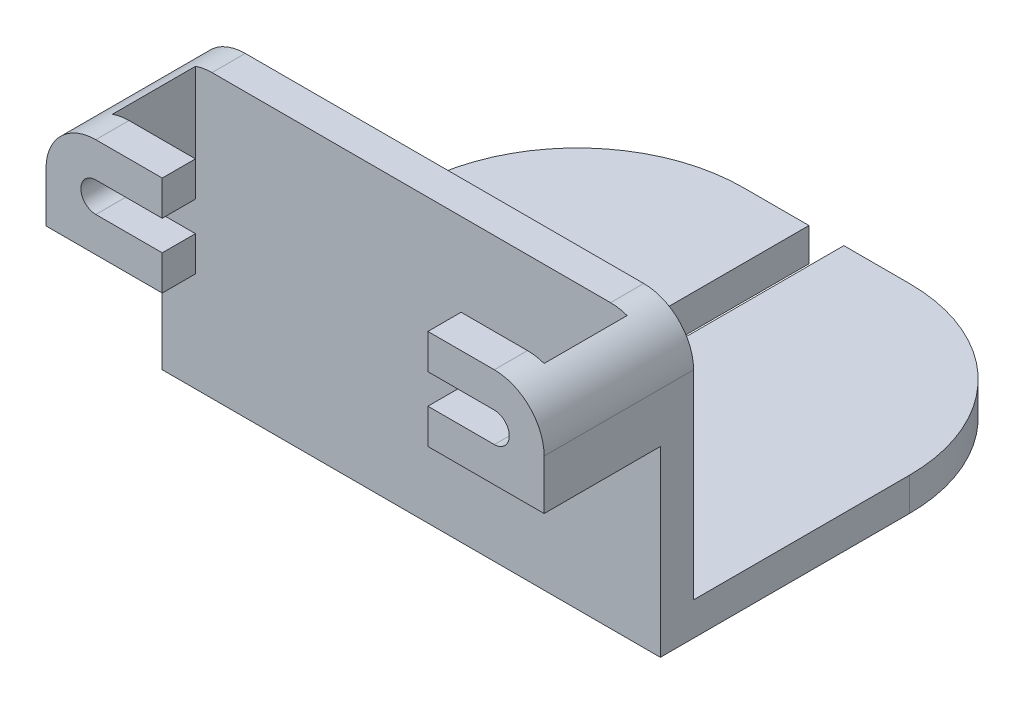
ISO-10303-21;
HEADER;
FILE_DESCRIPTION(('STEP AP214'),'2;1');
FILE_NAME('part.step','',(''),(''),'','','');
FILE_SCHEMA(('AUTOMOTIVE_DESIGN { 1 0 10303 214 1 1 1 1 }'));
ENDSEC;
DATA;
#1=APPLICATION_CONTEXT('core data for automotive mechanical design processes');
#2=APPLICATION_PROTOCOL_DEFINITION('international standard','automotive_design',2000,#1);
#3=PRODUCT_CONTEXT('',#1,'mechanical');
#4=PRODUCT('Part','Part','',(#3));
#5=PRODUCT_RELATED_PRODUCT_CATEGORY('part','',(#4));
#6=PRODUCT_DEFINITION_FORMATION('','',#4);
#7=PRODUCT_DEFINITION_CONTEXT('part definition',#1,'design');
#8=PRODUCT_DEFINITION('design','',#6,#7);
#9=PRODUCT_DEFINITION_SHAPE('','',#8);
#10=(LENGTH_UNIT() NAMED_UNIT(*) SI_UNIT(.MILLI.,.METRE.));
#11=(NAMED_UNIT(*) PLANE_ANGLE_UNIT() SI_UNIT($,.RADIAN.));
#12=(NAMED_UNIT(*) SI_UNIT($,.STERADIAN.) SOLID_ANGLE_UNIT());
#13=UNCERTAINTY_MEASURE_WITH_UNIT(LENGTH_MEASURE(1.E-05),#10,'distance_accuracy_value','');
#14=(GEOMETRIC_REPRESENTATION_CONTEXT(3) GLOBAL_UNCERTAINTY_ASSIGNED_CONTEXT((#13)) GLOBAL_UNIT_ASSIGNED_CONTEXT((#10,
#11,#12)) REPRESENTATION_CONTEXT('',''));
#15=CARTESIAN_POINT('',(0.,0.,0.));
#16=DIRECTION('',(0.,0.,1.));
#17=DIRECTION('',(1.,0.,0.));
#18=AXIS2_PLACEMENT_3D('',#15,#16,#17);
#19=CARTESIAN_POINT('',(30.,17.,0.));
#20=DIRECTION('',(0.,-1.,0.));
#21=DIRECTION('',(0.,0.,-1.));
#22=AXIS2_PLACEMENT_3D('',#19,#20,#21);
#23=PLANE('',#22);
#24=DIRECTION('',(1.,0.,0.));
#25=VECTOR('',#24,1.);
#26=CARTESIAN_POINT('',(30.,17.,7.));
#27=LINE('',#26,#25);
#28=CARTESIAN_POINT('',(23.,17.,7.));
#29=VERTEX_POINT('',#28);
#30=CARTESIAN_POINT('',(27.,17.,7.));
#31=VERTEX_POINT('',#30);
#32=EDGE_CURVE('E392',#29,#31,#27,.T.);
#33=ORIENTED_EDGE('',*,*,#32,.T.);
#34=DIRECTION('',(0.,0.,1.));
#35=VECTOR('',#34,1.);
#36=CARTESIAN_POINT('',(27.,17.,0.));
#37=LINE('',#36,#35);
#38=CARTESIAN_POINT('',(27.,17.,5.00000000000001));
#39=VERTEX_POINT('',#38);
#40=EDGE_CURVE('E582',#31,#39,#37,.F.);
#41=ORIENTED_EDGE('',*,*,#40,.T.);
#42=DIRECTION('',(-1.,0.,0.));
#43=VECTOR('',#42,1.);
#44=CARTESIAN_POINT('',(23.,17.,5.));
#45=LINE('',#44,#43);
#46=CARTESIAN_POINT('',(23.,17.,5.));
#47=VERTEX_POINT('',#46);
#48=EDGE_CURVE('E401',#39,#47,#45,.T.);
#49=ORIENTED_EDGE('',*,*,#48,.T.);
#50=DIRECTION('',(0.,0.,1.));
#51=VECTOR('',#50,1.);
#52=CARTESIAN_POINT('',(23.,17.,7.));
#53=LINE('',#52,#51);
#54=EDGE_CURVE('E396',#47,#29,#53,.T.);
#55=ORIENTED_EDGE('',*,*,#54,.T.);
#56=EDGE_LOOP('',(#33,#41,#49,#55));
#57=FACE_BOUND('',#56,.T.);
#58=ADVANCED_FACE('F42',(#57),#23,.F.);
#59=DIRECTION('',(-1.,0.,0.));
#60=VECTOR('',#59,1.);
#61=CARTESIAN_POINT('',(30.,17.,0.));
#62=LINE('',#61,#60);
#63=CARTESIAN_POINT('',(27.,17.,0.));
#64=VERTEX_POINT('',#63);
#65=CARTESIAN_POINT('',(3.,17.,0.));
#66=VERTEX_POINT('',#65);
#67=EDGE_CURVE('E495',#64,#66,#62,.T.);
#68=ORIENTED_EDGE('',*,*,#67,.F.);
#69=DIRECTION('',(0.,0.,1.));
#70=VECTOR('',#69,1.);
#71=CARTESIAN_POINT('',(27.,17.,0.));
#72=LINE('',#71,#70);
#73=CARTESIAN_POINT('',(27.,17.,-2.));
#74=VERTEX_POINT('',#73);
#75=EDGE_CURVE('E579',#64,#74,#72,.F.);
#76=ORIENTED_EDGE('',*,*,#75,.T.);
#77=DIRECTION('',(-1.,0.,0.));
#78=VECTOR('',#77,1.);
#79=CARTESIAN_POINT('',(30.,17.,-2.));
#80=LINE('',#79,#78);
#81=CARTESIAN_POINT('',(3.,17.,-2.));
#82=VERTEX_POINT('',#81);
#83=EDGE_CURVE('E511',#74,#82,#80,.T.);
#84=ORIENTED_EDGE('',*,*,#83,.T.);
#85=DIRECTION('',(0.,0.,1.));
#86=VECTOR('',#85,1.);
#87=CARTESIAN_POINT('',(3.,17.,7.));
#88=LINE('',#87,#86);
#89=EDGE_CURVE('E575',#82,#66,#88,.T.);
#90=ORIENTED_EDGE('',*,*,#89,.T.);
#91=EDGE_LOOP('',(#68,#76,#84,#90));
#92=FACE_BOUND('',#91,.T.);
#93=ADVANCED_FACE('F667',(#92),#23,.F.);
#94=CARTESIAN_POINT('',(30.,0.,-25.));
#95=DIRECTION('',(0.,0.,1.));
#96=DIRECTION('',(1.,0.,0.));
#97=AXIS2_PLACEMENT_3D('',#94,#95,#96);
#98=PLANE('',#97);
#99=DIRECTION('',(-1.,0.,0.));
#100=VECTOR('',#99,1.);
#101=CARTESIAN_POINT('',(30.,2.,-25.));
#102=LINE('',#101,#100);
#103=CARTESIAN_POINT('',(20.,2.,-25.));
#104=VERTEX_POINT('',#103);
#105=CARTESIAN_POINT('',(16.05,2.,-25.));
#106=VERTEX_POINT('',#105);
#107=EDGE_CURVE('E520',#104,#106,#102,.T.);
#108=ORIENTED_EDGE('',*,*,#107,.F.);
#109=DIRECTION('',(0.,1.,0.));
#110=VECTOR('',#109,1.);
#111=CARTESIAN_POINT('',(20.,0.,-25.));
#112=LINE('',#111,#110);
#113=CARTESIAN_POINT('',(20.,0.,-25.));
#114=VERTEX_POINT('',#113);
#115=EDGE_CURVE('E562',#104,#114,#112,.F.);
#116=ORIENTED_EDGE('',*,*,#115,.T.);
#117=DIRECTION('',(-1.,0.,0.));
#118=VECTOR('',#117,1.);
#119=CARTESIAN_POINT('',(30.,0.,-25.));
#120=LINE('',#119,#118);
#121=CARTESIAN_POINT('',(16.05,0.,-25.));
#122=VERTEX_POINT('',#121);
#123=EDGE_CURVE('E524',#114,#122,#120,.T.);
#124=ORIENTED_EDGE('',*,*,#123,.T.);
#125=DIRECTION('',(0.,1.,0.));
#126=VECTOR('',#125,1.);
#127=CARTESIAN_POINT('',(16.05,0.,-25.));
#128=LINE('',#127,#126);
#129=EDGE_CURVE('E307',#122,#106,#128,.T.);
#130=ORIENTED_EDGE('',*,*,#129,.T.);
#131=EDGE_LOOP('',(#108,#116,#124,#130));
#132=FACE_BOUND('',#131,.T.);
#133=ADVANCED_FACE('F751',(#132),#98,.F.);
#134=CARTESIAN_POINT('',(7.,11.,7.00000000000002));
#135=DIRECTION('',(1.,0.,0.));
#136=DIRECTION('',(0.,0.,-1.));
#137=AXIS2_PLACEMENT_3D('',#134,#135,#136);
#138=PLANE('',#137);
#139=DIRECTION('',(0.,0.,-1.));
#140=VECTOR('',#139,1.);
#141=CARTESIAN_POINT('',(7.,13.1,7.00000000000002));
#142=LINE('',#141,#140);
#143=CARTESIAN_POINT('',(7.,13.1,7.00000000000003));
#144=VERTEX_POINT('',#143);
#145=CARTESIAN_POINT('',(7.,13.1,5.));
#146=VERTEX_POINT('',#145);
#147=EDGE_CURVE('E363',#144,#146,#142,.T.);
#148=ORIENTED_EDGE('',*,*,#147,.F.);
#149=DIRECTION('',(0.,1.,0.));
#150=VECTOR('',#149,1.);
#151=CARTESIAN_POINT('',(7.,11.,7.00000000000002));
#152=LINE('',#151,#150);
#153=CARTESIAN_POINT('',(7.,11.,7.00000000000002));
#154=VERTEX_POINT('',#153);
#155=EDGE_CURVE('E473',#154,#144,#152,.T.);
#156=ORIENTED_EDGE('',*,*,#155,.F.);
#157=DIRECTION('',(0.,0.,-1.));
#158=VECTOR('',#157,1.);
#159=CARTESIAN_POINT('',(7.,11.,7.00000000000002));
#160=LINE('',#159,#158);
#161=CARTESIAN_POINT('',(7.,11.,5.00000000000002));
#162=VERTEX_POINT('',#161);
#163=EDGE_CURVE('E439',#154,#162,#160,.T.);
#164=ORIENTED_EDGE('',*,*,#163,.T.);
#165=DIRECTION('',(0.,1.,0.));
#166=VECTOR('',#165,1.);
#167=CARTESIAN_POINT('',(7.,11.,5.00000000000002));
#168=LINE('',#167,#166);
#169=EDGE_CURVE('E468',#162,#146,#168,.T.);
#170=ORIENTED_EDGE('',*,*,#169,.T.);
#171=EDGE_LOOP('',(#148,#156,#164,#170));
#172=FACE_BOUND('',#171,.T.);
#173=ADVANCED_FACE('F724',(#172),#138,.T.);
#174=CARTESIAN_POINT('',(23.,11.,7.00000000000002));
#175=DIRECTION('',(-1.,0.,0.));
#176=DIRECTION('',(0.,0.,1.));
#177=AXIS2_PLACEMENT_3D('',#174,#175,#176);
#178=PLANE('',#177);
#179=DIRECTION('',(0.,0.,-1.));
#180=VECTOR('',#179,1.);
#181=CARTESIAN_POINT('',(23.,14.9,7.00000000000002));
#182=LINE('',#181,#180);
#183=CARTESIAN_POINT('',(23.,14.9,7.00000000000003));
#184=VERTEX_POINT('',#183);
#185=CARTESIAN_POINT('',(23.,14.9,5.));
#186=VERTEX_POINT('',#185);
#187=EDGE_CURVE('E534',#184,#186,#182,.T.);
#188=ORIENTED_EDGE('',*,*,#187,.F.);
#189=DIRECTION('',(0.,1.,0.));
#190=VECTOR('',#189,1.);
#191=CARTESIAN_POINT('',(23.,11.,7.00000000000002));
#192=LINE('',#191,#190);
#193=EDGE_CURVE('E380',#184,#29,#192,.T.);
#194=ORIENTED_EDGE('',*,*,#193,.T.);
#195=ORIENTED_EDGE('',*,*,#54,.F.);
#196=DIRECTION('',(0.,1.,0.));
#197=VECTOR('',#196,1.);
#198=CARTESIAN_POINT('',(23.,11.,5.00000000000002));
#199=LINE('',#198,#197);
#200=EDGE_CURVE('E375',#186,#47,#199,.T.);
#201=ORIENTED_EDGE('',*,*,#200,.F.);
#202=EDGE_LOOP('',(#188,#194,#195,#201));
#203=FACE_BOUND('',#202,.T.);
#204=ADVANCED_FACE('F622',(#203),#178,.T.);
#205=CARTESIAN_POINT('',(30.,0.,0.));
#206=DIRECTION('',(0.,0.,-1.));
#207=DIRECTION('',(-1.,0.,0.));
#208=AXIS2_PLACEMENT_3D('',#205,#206,#207);
#209=PLANE('',#208);
#210=DIRECTION('',(0.,1.,0.));
#211=VECTOR('',#210,1.);
#212=CARTESIAN_POINT('',(28.,11.,0.));
#213=LINE('',#212,#211);
#214=CARTESIAN_POINT('',(28.,11.,0.));
#215=VERTEX_POINT('',#214);
#216=CARTESIAN_POINT('',(28.,16.8284271247462,0.));
#217=VERTEX_POINT('',#216);
#218=EDGE_CURVE('E385',#215,#217,#213,.T.);
#219=ORIENTED_EDGE('',*,*,#218,.T.);
#220=CARTESIAN_POINT('',(27.,14.,0.));
#221=DIRECTION('',(0.,0.,-1.));
#222=DIRECTION('',(-1.,0.,0.));
#223=AXIS2_PLACEMENT_3D('',#220,#221,#222);
#224=CIRCLE('',#223,3.);
#225=EDGE_CURVE('E594',#217,#64,#224,.F.);
#226=ORIENTED_EDGE('',*,*,#225,.T.);
#227=ORIENTED_EDGE('',*,*,#67,.T.);
#228=CARTESIAN_POINT('',(3.,14.,0.));
#229=DIRECTION('',(0.,0.,-1.));
#230=DIRECTION('',(-1.,0.,0.));
#231=AXIS2_PLACEMENT_3D('',#228,#229,#230);
#232=CIRCLE('',#231,3.);
#233=CARTESIAN_POINT('',(2.,16.8284271247462,0.));
#234=VERTEX_POINT('',#233);
#235=EDGE_CURVE('E591',#66,#234,#232,.F.);
#236=ORIENTED_EDGE('',*,*,#235,.T.);
#237=DIRECTION('',(0.,1.,0.));
#238=VECTOR('',#237,1.);
#239=CARTESIAN_POINT('',(2.,11.,0.));
#240=LINE('',#239,#238);
#241=CARTESIAN_POINT('',(2.,11.,0.));
#242=VERTEX_POINT('',#241);
#243=EDGE_CURVE('E461',#242,#234,#240,.T.);
#244=ORIENTED_EDGE('',*,*,#243,.F.);
#245=DIRECTION('',(-1.,0.,0.));
#246=VECTOR('',#245,1.);
#247=CARTESIAN_POINT('',(2.,11.,0.));
#248=LINE('',#247,#246);
#249=CARTESIAN_POINT('',(0.,11.,0.));
#250=VERTEX_POINT('',#249);
#251=EDGE_CURVE('E426',#242,#250,#248,.T.);
#252=ORIENTED_EDGE('',*,*,#251,.T.);
#253=DIRECTION('',(0.,-1.,0.));
#254=VECTOR('',#253,1.);
#255=CARTESIAN_POINT('',(0.,0.,0.));
#256=LINE('',#255,#254);
#257=CARTESIAN_POINT('',(0.,0.,0.));
#258=VERTEX_POINT('',#257);
#259=EDGE_CURVE('E464',#250,#258,#256,.T.);
#260=ORIENTED_EDGE('',*,*,#259,.T.);
#261=DIRECTION('',(-1.,0.,0.));
#262=VECTOR('',#261,1.);
#263=CARTESIAN_POINT('',(30.,0.,0.));
#264=LINE('',#263,#262);
#265=CARTESIAN_POINT('',(30.,0.,0.));
#266=VERTEX_POINT('',#265);
#267=EDGE_CURVE('E527',#266,#258,#264,.T.);
#268=ORIENTED_EDGE('',*,*,#267,.F.);
#269=DIRECTION('',(0.,-1.,0.));
#270=VECTOR('',#269,1.);
#271=CARTESIAN_POINT('',(30.,0.,0.));
#272=LINE('',#271,#270);
#273=CARTESIAN_POINT('',(30.,11.,0.));
#274=VERTEX_POINT('',#273);
#275=EDGE_CURVE('E480',#274,#266,#272,.T.);
#276=ORIENTED_EDGE('',*,*,#275,.F.);
#277=DIRECTION('',(-1.,0.,0.));
#278=VECTOR('',#277,1.);
#279=CARTESIAN_POINT('',(28.,11.,0.));
#280=LINE('',#279,#278);
#281=EDGE_CURVE('E408',#274,#215,#280,.T.);
#282=ORIENTED_EDGE('',*,*,#281,.T.);
#283=EDGE_LOOP('',(#219,#226,#227,#236,#244,#252,#260,#268,#276,#282));
#284=FACE_BOUND('',#283,.T.);
#285=ADVANCED_FACE('F665',(#284),#209,.F.);
#286=CARTESIAN_POINT('',(30.,0.,0.));
#287=DIRECTION('',(0.,1.,0.));
#288=DIRECTION('',(0.,0.,1.));
#289=AXIS2_PLACEMENT_3D('',#286,#287,#288);
#290=PLANE('',#289);
#291=DIRECTION('',(0.,0.,-1.));
#292=VECTOR('',#291,1.);
#293=CARTESIAN_POINT('',(0.,0.,0.));
#294=LINE('',#293,#292);
#295=CARTESIAN_POINT('',(0.,0.,-15.));
#296=VERTEX_POINT('',#295);
#297=EDGE_CURVE('E498',#258,#296,#294,.T.);
#298=ORIENTED_EDGE('',*,*,#297,.T.);
#299=CARTESIAN_POINT('',(10.,0.,-15.));
#300=DIRECTION('',(0.,1.,0.));
#301=DIRECTION('',(0.,0.,1.));
#302=AXIS2_PLACEMENT_3D('',#299,#300,#301);
#303=CIRCLE('',#302,10.);
#304=CARTESIAN_POINT('',(10.,0.,-25.));
#305=VERTEX_POINT('',#304);
#306=EDGE_CURVE('E555',#296,#305,#303,.F.);
#307=ORIENTED_EDGE('',*,*,#306,.T.);
#308=CARTESIAN_POINT('',(13.95,0.,-25.));
#309=VERTEX_POINT('',#308);
#310=EDGE_CURVE('E523',#309,#305,#120,.T.);
#311=ORIENTED_EDGE('',*,*,#310,.F.);
#312=DIRECTION('',(0.,0.,1.));
#313=VECTOR('',#312,1.);
#314=CARTESIAN_POINT('',(13.95,0.,0.));
#315=LINE('',#314,#313);
#316=CARTESIAN_POINT('',(13.95,0.,-11.5291053910497));
#317=VERTEX_POINT('',#316);
#318=EDGE_CURVE('E302',#309,#317,#315,.T.);
#319=ORIENTED_EDGE('',*,*,#318,.T.);
#320=CARTESIAN_POINT('',(15.,0.,-11.5291053910497));
#321=DIRECTION('',(0.,1.,0.));
#322=DIRECTION('',(0.,0.,1.));
#323=AXIS2_PLACEMENT_3D('',#320,#321,#322);
#324=CIRCLE('',#323,1.05);
#325=CARTESIAN_POINT('',(16.05,0.,-11.5291053910497));
#326=VERTEX_POINT('',#325);
#327=EDGE_CURVE('E272',#317,#326,#324,.T.);
#328=ORIENTED_EDGE('',*,*,#327,.T.);
#329=DIRECTION('',(0.,0.,-1.));
#330=VECTOR('',#329,1.);
#331=CARTESIAN_POINT('',(16.05,0.,0.));
#332=LINE('',#331,#330);
#333=EDGE_CURVE('E311',#326,#122,#332,.T.);
#334=ORIENTED_EDGE('',*,*,#333,.T.);
#335=ORIENTED_EDGE('',*,*,#123,.F.);
#336=CARTESIAN_POINT('',(20.,0.,-15.));
#337=DIRECTION('',(0.,1.,0.));
#338=DIRECTION('',(0.,0.,1.));
#339=AXIS2_PLACEMENT_3D('',#336,#337,#338);
#340=CIRCLE('',#339,10.);
#341=CARTESIAN_POINT('',(30.,0.,-15.));
#342=VERTEX_POINT('',#341);
#343=EDGE_CURVE('E552',#114,#342,#340,.F.);
#344=ORIENTED_EDGE('',*,*,#343,.T.);
#345=DIRECTION('',(0.,0.,-1.));
#346=VECTOR('',#345,1.);
#347=CARTESIAN_POINT('',(30.,0.,0.));
#348=LINE('',#347,#346);
#349=EDGE_CURVE('E483',#266,#342,#348,.T.);
#350=ORIENTED_EDGE('',*,*,#349,.F.);
#351=ORIENTED_EDGE('',*,*,#267,.T.);
#352=EDGE_LOOP('',(#298,#307,#311,#319,#328,#334,#335,#344,#350,#351));
#353=FACE_BOUND('',#352,.T.);
#354=ADVANCED_FACE('F692',(#353),#290,.F.);
#355=ORIENTED_EDGE('',*,*,#310,.T.);
#356=DIRECTION('',(0.,1.,0.));
#357=VECTOR('',#356,1.);
#358=CARTESIAN_POINT('',(10.,2.,-25.));
#359=LINE('',#358,#357);
#360=CARTESIAN_POINT('',(10.,2.,-25.));
#361=VERTEX_POINT('',#360);
#362=EDGE_CURVE('E288',#305,#361,#359,.T.);
#363=ORIENTED_EDGE('',*,*,#362,.T.);
#364=CARTESIAN_POINT('',(13.95,2.,-25.));
#365=VERTEX_POINT('',#364);
#366=EDGE_CURVE('E519',#365,#361,#102,.T.);
#367=ORIENTED_EDGE('',*,*,#366,.F.);
#368=DIRECTION('',(0.,-1.,0.));
#369=VECTOR('',#368,1.);
#370=CARTESIAN_POINT('',(13.95,0.,-25.));
#371=LINE('',#370,#369);
#372=EDGE_CURVE('E283',#365,#309,#371,.T.);
#373=ORIENTED_EDGE('',*,*,#372,.T.);
#374=EDGE_LOOP('',(#355,#363,#367,#373));
#375=FACE_BOUND('',#374,.T.);
#376=ADVANCED_FACE('F764',(#375),#98,.F.);
#377=CARTESIAN_POINT('',(30.,2.,-25.));
#378=DIRECTION('',(0.,-1.,0.));
#379=DIRECTION('',(0.,0.,-1.));
#380=AXIS2_PLACEMENT_3D('',#377,#378,#379);
#381=PLANE('',#380);
#382=ORIENTED_EDGE('',*,*,#366,.T.);
#383=CARTESIAN_POINT('',(10.,2.,-15.));
#384=DIRECTION('',(0.,-1.,0.));
#385=DIRECTION('',(0.,0.,-1.));
#386=AXIS2_PLACEMENT_3D('',#383,#384,#385);
#387=CIRCLE('',#386,10.);
#388=CARTESIAN_POINT('',(0.,2.,-15.));
#389=VERTEX_POINT('',#388);
#390=EDGE_CURVE('E546',#361,#389,#387,.F.);
#391=ORIENTED_EDGE('',*,*,#390,.T.);
#392=DIRECTION('',(0.,0.,1.));
#393=VECTOR('',#392,1.);
#394=CARTESIAN_POINT('',(0.,2.,-25.));
#395=LINE('',#394,#393);
#396=CARTESIAN_POINT('',(0.,2.,-2.00000000000001));
#397=VERTEX_POINT('',#396);
#398=EDGE_CURVE('E502',#389,#397,#395,.T.);
#399=ORIENTED_EDGE('',*,*,#398,.T.);
#400=DIRECTION('',(-1.,0.,0.));
#401=VECTOR('',#400,1.);
#402=CARTESIAN_POINT('',(30.,2.,-2.00000000000001));
#403=LINE('',#402,#401);
#404=CARTESIAN_POINT('',(30.,2.,-2.00000000000001));
#405=VERTEX_POINT('',#404);
#406=EDGE_CURVE('E515',#405,#397,#403,.T.);
#407=ORIENTED_EDGE('',*,*,#406,.F.);
#408=DIRECTION('',(0.,0.,1.));
#409=VECTOR('',#408,1.);
#410=CARTESIAN_POINT('',(30.,2.,-25.));
#411=LINE('',#410,#409);
#412=CARTESIAN_POINT('',(30.,2.,-15.));
#413=VERTEX_POINT('',#412);
#414=EDGE_CURVE('E488',#413,#405,#411,.T.);
#415=ORIENTED_EDGE('',*,*,#414,.F.);
#416=CARTESIAN_POINT('',(20.,2.,-15.));
#417=DIRECTION('',(0.,-1.,0.));
#418=DIRECTION('',(0.,0.,-1.));
#419=AXIS2_PLACEMENT_3D('',#416,#417,#418);
#420=CIRCLE('',#419,10.);
#421=EDGE_CURVE('E543',#413,#104,#420,.F.);
#422=ORIENTED_EDGE('',*,*,#421,.T.);
#423=ORIENTED_EDGE('',*,*,#107,.T.);
#424=DIRECTION('',(0.,0.,-1.));
#425=VECTOR('',#424,1.);
#426=CARTESIAN_POINT('',(16.05,2.,-25.5291053910497));
#427=LINE('',#426,#425);
#428=CARTESIAN_POINT('',(16.05,2.,-11.5291053910497));
#429=VERTEX_POINT('',#428);
#430=EDGE_CURVE('E277',#429,#106,#427,.T.);
#431=ORIENTED_EDGE('',*,*,#430,.F.);
#432=CARTESIAN_POINT('',(15.,2.,-11.5291053910497));
#433=DIRECTION('',(0.,1.,0.));
#434=DIRECTION('',(0.,0.,1.));
#435=AXIS2_PLACEMENT_3D('',#432,#433,#434);
#436=CIRCLE('',#435,1.05);
#437=CARTESIAN_POINT('',(13.95,2.,-11.5291053910497));
#438=VERTEX_POINT('',#437);
#439=EDGE_CURVE('E269',#438,#429,#436,.T.);
#440=ORIENTED_EDGE('',*,*,#439,.F.);
#441=DIRECTION('',(0.,0.,-1.));
#442=VECTOR('',#441,1.);
#443=CARTESIAN_POINT('',(13.95,2.,-25.));
#444=LINE('',#443,#442);
#445=EDGE_CURVE('E280',#438,#365,#444,.T.);
#446=ORIENTED_EDGE('',*,*,#445,.T.);
#447=EDGE_LOOP('',(#382,#391,#399,#407,#415,#422,#423,#431,#440,#446));
#448=FACE_BOUND('',#447,.T.);
#449=ADVANCED_FACE('F291',(#448),#381,.F.);
#450=CARTESIAN_POINT('',(30.,17.,-2.));
#451=DIRECTION('',(0.,0.,1.));
#452=DIRECTION('',(0.,-1.,0.));
#453=AXIS2_PLACEMENT_3D('',#450,#451,#452);
#454=PLANE('',#453);
#455=ORIENTED_EDGE('',*,*,#83,.F.);
#456=CARTESIAN_POINT('',(27.,14.,-2.));
#457=DIRECTION('',(0.,0.,1.));
#458=DIRECTION('',(0.,-1.,0.));
#459=AXIS2_PLACEMENT_3D('',#456,#457,#458);
#460=CIRCLE('',#459,3.);
#461=CARTESIAN_POINT('',(30.,14.,-2.));
#462=VERTEX_POINT('',#461);
#463=EDGE_CURVE('E600',#74,#462,#460,.F.);
#464=ORIENTED_EDGE('',*,*,#463,.T.);
#465=DIRECTION('',(0.,1.,0.));
#466=VECTOR('',#465,1.);
#467=CARTESIAN_POINT('',(30.,17.,-2.));
#468=LINE('',#467,#466);
#469=EDGE_CURVE('E491',#405,#462,#468,.T.);
#470=ORIENTED_EDGE('',*,*,#469,.F.);
#471=ORIENTED_EDGE('',*,*,#406,.T.);
#472=DIRECTION('',(0.,1.,0.));
#473=VECTOR('',#472,1.);
#474=CARTESIAN_POINT('',(0.,17.,-2.));
#475=LINE('',#474,#473);
#476=CARTESIAN_POINT('',(0.,14.,-2.));
#477=VERTEX_POINT('',#476);
#478=EDGE_CURVE('E484',#397,#477,#475,.T.);
#479=ORIENTED_EDGE('',*,*,#478,.T.);
#480=CARTESIAN_POINT('',(3.,14.,-2.));
#481=DIRECTION('',(0.,0.,1.));
#482=DIRECTION('',(0.,-1.,0.));
#483=AXIS2_PLACEMENT_3D('',#480,#481,#482);
#484=CIRCLE('',#483,3.);
#485=EDGE_CURVE('E597',#477,#82,#484,.F.);
#486=ORIENTED_EDGE('',*,*,#485,.T.);
#487=EDGE_LOOP('',(#455,#464,#470,#471,#479,#486));
#488=FACE_BOUND('',#487,.T.);
#489=ADVANCED_FACE('F701',(#488),#454,.F.);
#490=DIRECTION('',(-1.,0.,0.));
#491=VECTOR('',#490,1.);
#492=CARTESIAN_POINT('',(7.,17.,5.));
#493=LINE('',#492,#491);
#494=CARTESIAN_POINT('',(7.,17.,5.));
#495=VERTEX_POINT('',#494);
#496=CARTESIAN_POINT('',(3.,17.,5.00000000000001));
#497=VERTEX_POINT('',#496);
#498=EDGE_CURVE('E431',#495,#497,#493,.T.);
#499=ORIENTED_EDGE('',*,*,#498,.T.);
#500=DIRECTION('',(0.,0.,1.));
#501=VECTOR('',#500,1.);
#502=CARTESIAN_POINT('',(3.,17.,7.));
#503=LINE('',#502,#501);
#504=CARTESIAN_POINT('',(3.,17.,7.));
#505=VERTEX_POINT('',#504);
#506=EDGE_CURVE('E572',#497,#505,#503,.T.);
#507=ORIENTED_EDGE('',*,*,#506,.T.);
#508=DIRECTION('',(1.,0.,0.));
#509=VECTOR('',#508,1.);
#510=CARTESIAN_POINT('',(0.,17.,7.));
#511=LINE('',#510,#509);
#512=CARTESIAN_POINT('',(7.,17.,7.));
#513=VERTEX_POINT('',#512);
#514=EDGE_CURVE('E404',#505,#513,#511,.T.);
#515=ORIENTED_EDGE('',*,*,#514,.T.);
#516=DIRECTION('',(0.,0.,-1.));
#517=VECTOR('',#516,1.);
#518=CARTESIAN_POINT('',(7.,17.,7.));
#519=LINE('',#518,#517);
#520=EDGE_CURVE('E454',#513,#495,#519,.T.);
#521=ORIENTED_EDGE('',*,*,#520,.T.);
#522=EDGE_LOOP('',(#499,#507,#515,#521));
#523=FACE_BOUND('',#522,.T.);
#524=ADVANCED_FACE('F706',(#523),#23,.F.);
#525=CARTESIAN_POINT('',(30.,0.,0.));
#526=DIRECTION('',(-1.,0.,0.));
#527=DIRECTION('',(0.,0.,1.));
#528=AXIS2_PLACEMENT_3D('',#525,#526,#527);
#529=PLANE('',#528);
#530=ORIENTED_EDGE('',*,*,#469,.T.);
#531=DIRECTION('',(0.,0.,1.));
#532=VECTOR('',#531,1.);
#533=CARTESIAN_POINT('',(30.,14.,0.));
#534=LINE('',#533,#532);
#535=CARTESIAN_POINT('',(30.,14.,7.00000000000001));
#536=VERTEX_POINT('',#535);
#537=EDGE_CURVE('E565',#462,#536,#534,.T.);
#538=ORIENTED_EDGE('',*,*,#537,.T.);
#539=DIRECTION('',(0.,1.,0.));
#540=VECTOR('',#539,1.);
#541=CARTESIAN_POINT('',(30.,11.,7.00000000000002));
#542=LINE('',#541,#540);
#543=CARTESIAN_POINT('',(30.,11.,7.00000000000002));
#544=VERTEX_POINT('',#543);
#545=EDGE_CURVE('E381',#544,#536,#542,.T.);
#546=ORIENTED_EDGE('',*,*,#545,.F.);
#547=DIRECTION('',(0.,0.,-1.));
#548=VECTOR('',#547,1.);
#549=CARTESIAN_POINT('',(30.,11.,0.));
#550=LINE('',#549,#548);
#551=EDGE_CURVE('E412',#544,#274,#550,.T.);
#552=ORIENTED_EDGE('',*,*,#551,.T.);
#553=ORIENTED_EDGE('',*,*,#275,.T.);
#554=ORIENTED_EDGE('',*,*,#349,.T.);
#555=DIRECTION('',(0.,1.,0.));
#556=VECTOR('',#555,1.);
#557=CARTESIAN_POINT('',(30.,0.,-15.));
#558=LINE('',#557,#556);
#559=EDGE_CURVE('E558',#342,#413,#558,.T.);
#560=ORIENTED_EDGE('',*,*,#559,.T.);
#561=ORIENTED_EDGE('',*,*,#414,.T.);
#562=EDGE_LOOP('',(#530,#538,#546,#552,#553,#554,#560,#561));
#563=FACE_BOUND('',#562,.T.);
#564=ADVANCED_FACE('F696',(#563),#529,.F.);
#565=CARTESIAN_POINT('',(0.,0.,0.));
#566=DIRECTION('',(-1.,0.,0.));
#567=DIRECTION('',(0.,0.,1.));
#568=AXIS2_PLACEMENT_3D('',#565,#566,#567);
#569=PLANE('',#568);
#570=DIRECTION('',(0.,1.,0.));
#571=VECTOR('',#570,1.);
#572=CARTESIAN_POINT('',(0.,11.,7.00000000000002));
#573=LINE('',#572,#571);
#574=CARTESIAN_POINT('',(0.,11.,7.00000000000002));
#575=VERTEX_POINT('',#574);
#576=CARTESIAN_POINT('',(0.,14.,7.00000000000001));
#577=VERTEX_POINT('',#576);
#578=EDGE_CURVE('E451',#575,#577,#573,.T.);
#579=ORIENTED_EDGE('',*,*,#578,.T.);
#580=DIRECTION('',(0.,0.,1.));
#581=VECTOR('',#580,1.);
#582=CARTESIAN_POINT('',(0.,14.,-1.99999999999999));
#583=LINE('',#582,#581);
#584=EDGE_CURVE('E11',#577,#477,#583,.F.);
#585=ORIENTED_EDGE('',*,*,#584,.T.);
#586=ORIENTED_EDGE('',*,*,#478,.F.);
#587=ORIENTED_EDGE('',*,*,#398,.F.);
#588=DIRECTION('',(0.,1.,0.));
#589=VECTOR('',#588,1.);
#590=CARTESIAN_POINT('',(0.,0.,-15.));
#591=LINE('',#590,#589);
#592=EDGE_CURVE('E549',#389,#296,#591,.F.);
#593=ORIENTED_EDGE('',*,*,#592,.T.);
#594=ORIENTED_EDGE('',*,*,#297,.F.);
#595=ORIENTED_EDGE('',*,*,#259,.F.);
#596=DIRECTION('',(0.,0.,1.));
#597=VECTOR('',#596,1.);
#598=CARTESIAN_POINT('',(0.,11.,0.));
#599=LINE('',#598,#597);
#600=EDGE_CURVE('E430',#250,#575,#599,.T.);
#601=ORIENTED_EDGE('',*,*,#600,.T.);
#602=EDGE_LOOP('',(#579,#585,#586,#587,#593,#594,#595,#601));
#603=FACE_BOUND('',#602,.T.);
#604=ADVANCED_FACE('F686',(#603),#569,.T.);
#605=CARTESIAN_POINT('',(2.,11.,5.00000000000002));
#606=DIRECTION('',(1.,0.,0.));
#607=DIRECTION('',(0.,0.,-1.));
#608=AXIS2_PLACEMENT_3D('',#605,#606,#607);
#609=PLANE('',#608);
#610=ORIENTED_EDGE('',*,*,#243,.T.);
#611=DIRECTION('',(0.,0.,-1.));
#612=VECTOR('',#611,1.);
#613=CARTESIAN_POINT('',(2.,16.8284271247462,0.));
#614=LINE('',#613,#612);
#615=CARTESIAN_POINT('',(2.,16.8284271247462,5.00000000000001));
#616=VERTEX_POINT('',#615);
#617=EDGE_CURVE('E65',#234,#616,#614,.F.);
#618=ORIENTED_EDGE('',*,*,#617,.T.);
#619=DIRECTION('',(0.,1.,0.));
#620=VECTOR('',#619,1.);
#621=CARTESIAN_POINT('',(2.,11.,5.00000000000002));
#622=LINE('',#621,#620);
#623=CARTESIAN_POINT('',(2.,11.,5.00000000000002));
#624=VERTEX_POINT('',#623);
#625=EDGE_CURVE('E465',#624,#616,#622,.T.);
#626=ORIENTED_EDGE('',*,*,#625,.F.);
#627=DIRECTION('',(0.,0.,-1.));
#628=VECTOR('',#627,1.);
#629=CARTESIAN_POINT('',(2.,11.,5.00000000000002));
#630=LINE('',#629,#628);
#631=EDGE_CURVE('E447',#624,#242,#630,.T.);
#632=ORIENTED_EDGE('',*,*,#631,.T.);
#633=EDGE_LOOP('',(#610,#618,#626,#632));
#634=FACE_BOUND('',#633,.T.);
#635=ADVANCED_FACE('F675',(#634),#609,.T.);
#636=CARTESIAN_POINT('',(7.,11.,5.00000000000002));
#637=DIRECTION('',(0.,0.,-1.));
#638=DIRECTION('',(0.,1.,0.));
#639=AXIS2_PLACEMENT_3D('',#636,#637,#638);
#640=PLANE('',#639);
#641=ORIENTED_EDGE('',*,*,#625,.T.);
#642=CARTESIAN_POINT('',(3.,14.,5.00000000000001));
#643=DIRECTION('',(0.,0.,-1.));
#644=DIRECTION('',(0.,1.,0.));
#645=AXIS2_PLACEMENT_3D('',#642,#643,#644);
#646=CIRCLE('',#645,3.);
#647=EDGE_CURVE('E605',#616,#497,#646,.T.);
#648=ORIENTED_EDGE('',*,*,#647,.T.);
#649=ORIENTED_EDGE('',*,*,#498,.F.);
#650=CARTESIAN_POINT('',(7.,14.9,5.));
#651=VERTEX_POINT('',#650);
#652=EDGE_CURVE('E472',#651,#495,#168,.T.);
#653=ORIENTED_EDGE('',*,*,#652,.F.);
#654=DIRECTION('',(1.,0.,0.));
#655=VECTOR('',#654,1.);
#656=CARTESIAN_POINT('',(7.,14.9,5.00000000000001));
#657=LINE('',#656,#655);
#658=CARTESIAN_POINT('',(3.,14.9,5.00000000000001));
#659=VERTEX_POINT('',#658);
#660=EDGE_CURVE('E357',#659,#651,#657,.T.);
#661=ORIENTED_EDGE('',*,*,#660,.F.);
#662=CARTESIAN_POINT('',(3.,14.,5.00000000000001));
#663=DIRECTION('',(0.,0.,-1.));
#664=DIRECTION('',(0.,1.,0.));
#665=AXIS2_PLACEMENT_3D('',#662,#663,#664);
#666=CIRCLE('',#665,0.899999999999997);
#667=CARTESIAN_POINT('',(3.,13.1,5.00000000000001));
#668=VERTEX_POINT('',#667);
#669=EDGE_CURVE('E360',#668,#659,#666,.T.);
#670=ORIENTED_EDGE('',*,*,#669,.F.);
#671=DIRECTION('',(-1.,0.,0.));
#672=VECTOR('',#671,1.);
#673=CARTESIAN_POINT('',(7.,13.1,5.00000000000001));
#674=LINE('',#673,#672);
#675=EDGE_CURVE('E366',#146,#668,#674,.T.);
#676=ORIENTED_EDGE('',*,*,#675,.F.);
#677=ORIENTED_EDGE('',*,*,#169,.F.);
#678=DIRECTION('',(-1.,0.,0.));
#679=VECTOR('',#678,1.);
#680=CARTESIAN_POINT('',(7.,11.,5.00000000000002));
#681=LINE('',#680,#679);
#682=EDGE_CURVE('E443',#162,#624,#681,.T.);
#683=ORIENTED_EDGE('',*,*,#682,.T.);
#684=EDGE_LOOP('',(#641,#648,#649,#653,#661,#670,#676,#677,#683));
#685=FACE_BOUND('',#684,.T.);
#686=ADVANCED_FACE('F719',(#685),#640,.T.);
#687=DIRECTION('',(0.,0.,1.));
#688=VECTOR('',#687,1.);
#689=CARTESIAN_POINT('',(7.,14.9,7.00000000000002));
#690=LINE('',#689,#688);
#691=CARTESIAN_POINT('',(7.,14.9,7.00000000000001));
#692=VERTEX_POINT('',#691);
#693=EDGE_CURVE('E354',#651,#692,#690,.T.);
#694=ORIENTED_EDGE('',*,*,#693,.F.);
#695=ORIENTED_EDGE('',*,*,#652,.T.);
#696=ORIENTED_EDGE('',*,*,#520,.F.);
#697=EDGE_CURVE('E477',#692,#513,#152,.T.);
#698=ORIENTED_EDGE('',*,*,#697,.F.);
#699=EDGE_LOOP('',(#694,#695,#696,#698));
#700=FACE_BOUND('',#699,.T.);
#701=ADVANCED_FACE('F715',(#700),#138,.T.);
#702=CARTESIAN_POINT('',(0.,11.,7.00000000000002));
#703=DIRECTION('',(0.,0.,1.));
#704=DIRECTION('',(0.,-1.,0.));
#705=AXIS2_PLACEMENT_3D('',#702,#703,#704);
#706=PLANE('',#705);
#707=ORIENTED_EDGE('',*,*,#514,.F.);
#708=CARTESIAN_POINT('',(3.,14.,7.00000000000001));
#709=DIRECTION('',(0.,0.,1.));
#710=DIRECTION('',(0.,-1.,0.));
#711=AXIS2_PLACEMENT_3D('',#708,#709,#710);
#712=CIRCLE('',#711,3.);
#713=EDGE_CURVE('E51',#505,#577,#712,.T.);
#714=ORIENTED_EDGE('',*,*,#713,.T.);
#715=ORIENTED_EDGE('',*,*,#578,.F.);
#716=DIRECTION('',(1.,0.,0.));
#717=VECTOR('',#716,1.);
#718=CARTESIAN_POINT('',(0.,11.,7.00000000000002));
#719=LINE('',#718,#717);
#720=EDGE_CURVE('E435',#575,#154,#719,.T.);
#721=ORIENTED_EDGE('',*,*,#720,.T.);
#722=ORIENTED_EDGE('',*,*,#155,.T.);
#723=DIRECTION('',(1.,0.,0.));
#724=VECTOR('',#723,1.);
#725=CARTESIAN_POINT('',(7.65303462974388,13.1,7.00000000000003));
#726=LINE('',#725,#724);
#727=CARTESIAN_POINT('',(3.,13.1,7.00000000000003));
#728=VERTEX_POINT('',#727);
#729=EDGE_CURVE('E338',#728,#144,#726,.T.);
#730=ORIENTED_EDGE('',*,*,#729,.F.);
#731=CARTESIAN_POINT('',(3.,14.,7.00000000000003));
#732=DIRECTION('',(0.,0.,1.));
#733=DIRECTION('',(-1.,0.,0.));
#734=AXIS2_PLACEMENT_3D('',#731,#732,#733);
#735=CIRCLE('',#734,0.899999999999997);
#736=CARTESIAN_POINT('',(3.,14.9,7.00000000000003));
#737=VERTEX_POINT('',#736);
#738=EDGE_CURVE('E321',#737,#728,#735,.T.);
#739=ORIENTED_EDGE('',*,*,#738,.F.);
#740=DIRECTION('',(-1.,0.,0.));
#741=VECTOR('',#740,1.);
#742=CARTESIAN_POINT('',(0.,14.9,7.00000000000001));
#743=LINE('',#742,#741);
#744=EDGE_CURVE('E289',#692,#737,#743,.T.);
#745=ORIENTED_EDGE('',*,*,#744,.F.);
#746=ORIENTED_EDGE('',*,*,#697,.T.);
#747=EDGE_LOOP('',(#707,#714,#715,#721,#722,#730,#739,#745,#746));
#748=FACE_BOUND('',#747,.T.);
#749=ADVANCED_FACE('F708',(#748),#706,.T.);
#750=CARTESIAN_POINT('',(0.,11.,0.));
#751=DIRECTION('',(0.,1.,0.));
#752=DIRECTION('',(0.,0.,1.));
#753=AXIS2_PLACEMENT_3D('',#750,#751,#752);
#754=PLANE('',#753);
#755=ORIENTED_EDGE('',*,*,#251,.F.);
#756=ORIENTED_EDGE('',*,*,#631,.F.);
#757=ORIENTED_EDGE('',*,*,#682,.F.);
#758=ORIENTED_EDGE('',*,*,#163,.F.);
#759=ORIENTED_EDGE('',*,*,#720,.F.);
#760=ORIENTED_EDGE('',*,*,#600,.F.);
#761=EDGE_LOOP('',(#755,#756,#757,#758,#759,#760));
#762=FACE_BOUND('',#761,.T.);
#763=ADVANCED_FACE('F679',(#762),#754,.F.);
#764=CARTESIAN_POINT('',(23.,11.,5.00000000000002));
#765=DIRECTION('',(0.,0.,-1.));
#766=DIRECTION('',(0.,1.,0.));
#767=AXIS2_PLACEMENT_3D('',#764,#765,#766);
#768=PLANE('',#767);
#769=ORIENTED_EDGE('',*,*,#48,.F.);
#770=CARTESIAN_POINT('',(27.,14.,5.00000000000001));
#771=DIRECTION('',(0.,0.,-1.));
#772=DIRECTION('',(0.,1.,0.));
#773=AXIS2_PLACEMENT_3D('',#770,#771,#772);
#774=CIRCLE('',#773,3.);
#775=CARTESIAN_POINT('',(28.,16.8284271247462,5.00000000000001));
#776=VERTEX_POINT('',#775);
#777=EDGE_CURVE('E585',#39,#776,#774,.T.);
#778=ORIENTED_EDGE('',*,*,#777,.T.);
#779=DIRECTION('',(0.,1.,0.));
#780=VECTOR('',#779,1.);
#781=CARTESIAN_POINT('',(28.,11.,5.00000000000002));
#782=LINE('',#781,#780);
#783=CARTESIAN_POINT('',(28.,11.,5.00000000000002));
#784=VERTEX_POINT('',#783);
#785=EDGE_CURVE('E369',#784,#776,#782,.T.);
#786=ORIENTED_EDGE('',*,*,#785,.F.);
#787=DIRECTION('',(-1.,0.,0.));
#788=VECTOR('',#787,1.);
#789=CARTESIAN_POINT('',(23.,11.,5.00000000000002));
#790=LINE('',#789,#788);
#791=CARTESIAN_POINT('',(23.,11.,5.00000000000002));
#792=VERTEX_POINT('',#791);
#793=EDGE_CURVE('E397',#784,#792,#790,.T.);
#794=ORIENTED_EDGE('',*,*,#793,.T.);
#795=CARTESIAN_POINT('',(23.,13.1,5.00000000000001));
#796=VERTEX_POINT('',#795);
#797=EDGE_CURVE('E370',#792,#796,#199,.T.);
#798=ORIENTED_EDGE('',*,*,#797,.T.);
#799=DIRECTION('',(-1.,0.,0.));
#800=VECTOR('',#799,1.);
#801=CARTESIAN_POINT('',(23.,13.1,5.00000000000001));
#802=LINE('',#801,#800);
#803=CARTESIAN_POINT('',(27.,13.1,5.00000000000001));
#804=VERTEX_POINT('',#803);
#805=EDGE_CURVE('E332',#804,#796,#802,.T.);
#806=ORIENTED_EDGE('',*,*,#805,.F.);
#807=CARTESIAN_POINT('',(27.,14.,5.00000000000001));
#808=DIRECTION('',(0.,0.,-1.));
#809=DIRECTION('',(0.,1.,0.));
#810=AXIS2_PLACEMENT_3D('',#807,#808,#809);
#811=CIRCLE('',#810,0.899999999999997);
#812=CARTESIAN_POINT('',(27.,14.9,5.00000000000001));
#813=VERTEX_POINT('',#812);
#814=EDGE_CURVE('E351',#813,#804,#811,.T.);
#815=ORIENTED_EDGE('',*,*,#814,.F.);
#816=DIRECTION('',(1.,0.,0.));
#817=VECTOR('',#816,1.);
#818=CARTESIAN_POINT('',(23.,14.9,5.00000000000001));
#819=LINE('',#818,#817);
#820=EDGE_CURVE('E348',#186,#813,#819,.T.);
#821=ORIENTED_EDGE('',*,*,#820,.F.);
#822=ORIENTED_EDGE('',*,*,#200,.T.);
#823=EDGE_LOOP('',(#769,#778,#786,#794,#798,#806,#815,#821,#822));
#824=FACE_BOUND('',#823,.T.);
#825=ADVANCED_FACE('F633',(#824),#768,.T.);
#826=CARTESIAN_POINT('',(28.,11.,5.00000000000002));
#827=DIRECTION('',(-1.,0.,0.));
#828=DIRECTION('',(0.,0.,1.));
#829=AXIS2_PLACEMENT_3D('',#826,#827,#828);
#830=PLANE('',#829);
#831=ORIENTED_EDGE('',*,*,#785,.T.);
#832=DIRECTION('',(0.,0.,1.));
#833=VECTOR('',#832,1.);
#834=CARTESIAN_POINT('',(28.,16.8284271247462,5.00000000000001));
#835=LINE('',#834,#833);
#836=EDGE_CURVE('E588',#776,#217,#835,.F.);
#837=ORIENTED_EDGE('',*,*,#836,.T.);
#838=ORIENTED_EDGE('',*,*,#218,.F.);
#839=DIRECTION('',(0.,0.,1.));
#840=VECTOR('',#839,1.);
#841=CARTESIAN_POINT('',(28.,11.,5.00000000000002));
#842=LINE('',#841,#840);
#843=EDGE_CURVE('E374',#215,#784,#842,.T.);
#844=ORIENTED_EDGE('',*,*,#843,.T.);
#845=EDGE_LOOP('',(#831,#837,#838,#844));
#846=FACE_BOUND('',#845,.T.);
#847=ADVANCED_FACE('F657',(#846),#830,.T.);
#848=CARTESIAN_POINT('',(30.,11.,7.00000000000002));
#849=DIRECTION('',(0.,0.,1.));
#850=DIRECTION('',(0.,-1.,0.));
#851=AXIS2_PLACEMENT_3D('',#848,#849,#850);
#852=PLANE('',#851);
#853=ORIENTED_EDGE('',*,*,#545,.T.);
#854=CARTESIAN_POINT('',(27.,14.,7.00000000000001));
#855=DIRECTION('',(0.,0.,1.));
#856=DIRECTION('',(0.,-1.,0.));
#857=AXIS2_PLACEMENT_3D('',#854,#855,#856);
#858=CIRCLE('',#857,3.);
#859=EDGE_CURVE('E569',#536,#31,#858,.T.);
#860=ORIENTED_EDGE('',*,*,#859,.T.);
#861=ORIENTED_EDGE('',*,*,#32,.F.);
#862=ORIENTED_EDGE('',*,*,#193,.F.);
#863=DIRECTION('',(-1.,0.,0.));
#864=VECTOR('',#863,1.);
#865=CARTESIAN_POINT('',(22.3469653702561,14.9,7.00000000000003));
#866=LINE('',#865,#864);
#867=CARTESIAN_POINT('',(27.,14.9,7.00000000000003));
#868=VERTEX_POINT('',#867);
#869=EDGE_CURVE('E325',#868,#184,#866,.T.);
#870=ORIENTED_EDGE('',*,*,#869,.F.);
#871=CARTESIAN_POINT('',(27.,14.,7.00000000000003));
#872=DIRECTION('',(0.,0.,1.));
#873=DIRECTION('',(1.,0.,0.));
#874=AXIS2_PLACEMENT_3D('',#871,#872,#873);
#875=CIRCLE('',#874,0.899999999999997);
#876=CARTESIAN_POINT('',(27.,13.1,7.00000000000003));
#877=VERTEX_POINT('',#876);
#878=EDGE_CURVE('E320',#877,#868,#875,.T.);
#879=ORIENTED_EDGE('',*,*,#878,.F.);
#880=DIRECTION('',(1.,0.,0.));
#881=VECTOR('',#880,1.);
#882=CARTESIAN_POINT('',(22.3469653702561,13.1,7.00000000000003));
#883=LINE('',#882,#881);
#884=CARTESIAN_POINT('',(23.,13.1,7.00000000000003));
#885=VERTEX_POINT('',#884);
#886=EDGE_CURVE('E316',#885,#877,#883,.T.);
#887=ORIENTED_EDGE('',*,*,#886,.F.);
#888=CARTESIAN_POINT('',(23.,11.,7.00000000000002));
#889=VERTEX_POINT('',#888);
#890=EDGE_CURVE('E376',#889,#885,#192,.T.);
#891=ORIENTED_EDGE('',*,*,#890,.F.);
#892=DIRECTION('',(1.,0.,0.));
#893=VECTOR('',#892,1.);
#894=CARTESIAN_POINT('',(30.,11.,7.00000000000002));
#895=LINE('',#894,#893);
#896=EDGE_CURVE('E415',#889,#544,#895,.T.);
#897=ORIENTED_EDGE('',*,*,#896,.T.);
#898=EDGE_LOOP('',(#853,#860,#861,#862,#870,#879,#887,#891,#897));
#899=FACE_BOUND('',#898,.T.);
#900=ADVANCED_FACE('F626',(#899),#852,.T.);
#901=DIRECTION('',(0.,0.,1.));
#902=VECTOR('',#901,1.);
#903=CARTESIAN_POINT('',(23.,13.1,7.00000000000002));
#904=LINE('',#903,#902);
#905=EDGE_CURVE('E531',#796,#885,#904,.T.);
#906=ORIENTED_EDGE('',*,*,#905,.F.);
#907=ORIENTED_EDGE('',*,*,#797,.F.);
#908=DIRECTION('',(0.,0.,1.));
#909=VECTOR('',#908,1.);
#910=CARTESIAN_POINT('',(23.,11.,7.00000000000002));
#911=LINE('',#910,#909);
#912=EDGE_CURVE('E419',#792,#889,#911,.T.);
#913=ORIENTED_EDGE('',*,*,#912,.T.);
#914=ORIENTED_EDGE('',*,*,#890,.T.);
#915=EDGE_LOOP('',(#906,#907,#913,#914));
#916=FACE_BOUND('',#915,.T.);
#917=ADVANCED_FACE('F648',(#916),#178,.T.);
#918=CARTESIAN_POINT('',(0.,11.,0.));
#919=DIRECTION('',(0.,1.,0.));
#920=DIRECTION('',(0.,0.,1.));
#921=AXIS2_PLACEMENT_3D('',#918,#919,#920);
#922=PLANE('',#921);
#923=ORIENTED_EDGE('',*,*,#793,.F.);
#924=ORIENTED_EDGE('',*,*,#843,.F.);
#925=ORIENTED_EDGE('',*,*,#281,.F.);
#926=ORIENTED_EDGE('',*,*,#551,.F.);
#927=ORIENTED_EDGE('',*,*,#896,.F.);
#928=ORIENTED_EDGE('',*,*,#912,.F.);
#929=EDGE_LOOP('',(#923,#924,#925,#926,#927,#928));
#930=FACE_BOUND('',#929,.T.);
#931=ADVANCED_FACE('F652',(#930),#922,.F.);
#932=CARTESIAN_POINT('',(22.3469653702561,14.9,1.00000000000003));
#933=DIRECTION('',(0.,1.,0.));
#934=DIRECTION('',(-1.,0.,0.));
#935=AXIS2_PLACEMENT_3D('',#932,#933,#934);
#936=PLANE('',#935);
#937=ORIENTED_EDGE('',*,*,#820,.T.);
#938=DIRECTION('',(0.,0.,1.));
#939=VECTOR('',#938,1.);
#940=CARTESIAN_POINT('',(27.,14.9,1.00000000000003));
#941=LINE('',#940,#939);
#942=EDGE_CURVE('E329',#813,#868,#941,.T.);
#943=ORIENTED_EDGE('',*,*,#942,.T.);
#944=ORIENTED_EDGE('',*,*,#869,.T.);
#945=ORIENTED_EDGE('',*,*,#187,.T.);
#946=EDGE_LOOP('',(#937,#943,#944,#945));
#947=FACE_BOUND('',#946,.T.);
#948=ADVANCED_FACE('F638',(#947),#936,.F.);
#949=CARTESIAN_POINT('',(27.,14.,1.00000000000003));
#950=DIRECTION('',(0.,0.,1.));
#951=DIRECTION('',(1.,0.,0.));
#952=AXIS2_PLACEMENT_3D('',#949,#950,#951);
#953=CYLINDRICAL_SURFACE('',#952,0.899999999999997);
#954=ORIENTED_EDGE('',*,*,#814,.T.);
#955=DIRECTION('',(0.,0.,1.));
#956=VECTOR('',#955,1.);
#957=CARTESIAN_POINT('',(27.,13.1,1.00000000000003));
#958=LINE('',#957,#956);
#959=EDGE_CURVE('E328',#804,#877,#958,.T.);
#960=ORIENTED_EDGE('',*,*,#959,.T.);
#961=ORIENTED_EDGE('',*,*,#878,.T.);
#962=ORIENTED_EDGE('',*,*,#942,.F.);
#963=EDGE_LOOP('',(#954,#960,#961,#962));
#964=FACE_BOUND('',#963,.T.);
#965=ADVANCED_FACE('F640',(#964),#953,.F.);
#966=CARTESIAN_POINT('',(22.3469653702561,13.1,1.00000000000003));
#967=DIRECTION('',(0.,-1.,0.));
#968=DIRECTION('',(1.,0.,0.));
#969=AXIS2_PLACEMENT_3D('',#966,#967,#968);
#970=PLANE('',#969);
#971=ORIENTED_EDGE('',*,*,#805,.T.);
#972=ORIENTED_EDGE('',*,*,#905,.T.);
#973=ORIENTED_EDGE('',*,*,#886,.T.);
#974=ORIENTED_EDGE('',*,*,#959,.F.);
#975=EDGE_LOOP('',(#971,#972,#973,#974));
#976=FACE_BOUND('',#975,.T.);
#977=ADVANCED_FACE('F929',(#976),#970,.F.);
#978=CARTESIAN_POINT('',(7.65303462974388,13.1,1.00000000000003));
#979=DIRECTION('',(0.,-1.,0.));
#980=DIRECTION('',(1.,0.,0.));
#981=AXIS2_PLACEMENT_3D('',#978,#979,#980);
#982=PLANE('',#981);
#983=ORIENTED_EDGE('',*,*,#675,.T.);
#984=DIRECTION('',(0.,0.,1.));
#985=VECTOR('',#984,1.);
#986=CARTESIAN_POINT('',(3.,13.1,1.00000000000003));
#987=LINE('',#986,#985);
#988=EDGE_CURVE('E315',#668,#728,#987,.T.);
#989=ORIENTED_EDGE('',*,*,#988,.T.);
#990=ORIENTED_EDGE('',*,*,#729,.T.);
#991=ORIENTED_EDGE('',*,*,#147,.T.);
#992=EDGE_LOOP('',(#983,#989,#990,#991));
#993=FACE_BOUND('',#992,.T.);
#994=ADVANCED_FACE('F727',(#993),#982,.F.);
#995=CARTESIAN_POINT('',(3.,14.,1.00000000000003));
#996=DIRECTION('',(0.,0.,1.));
#997=DIRECTION('',(1.,0.,0.));
#998=AXIS2_PLACEMENT_3D('',#995,#996,#997);
#999=CYLINDRICAL_SURFACE('',#998,0.899999999999997);
#1000=ORIENTED_EDGE('',*,*,#669,.T.);
#1001=DIRECTION('',(0.,0.,1.));
#1002=VECTOR('',#1001,1.);
#1003=CARTESIAN_POINT('',(3.,14.9,1.00000000000003));
#1004=LINE('',#1003,#1002);
#1005=EDGE_CURVE('E335',#659,#737,#1004,.T.);
#1006=ORIENTED_EDGE('',*,*,#1005,.T.);
#1007=ORIENTED_EDGE('',*,*,#738,.T.);
#1008=ORIENTED_EDGE('',*,*,#988,.F.);
#1009=EDGE_LOOP('',(#1000,#1006,#1007,#1008));
#1010=FACE_BOUND('',#1009,.T.);
#1011=ADVANCED_FACE('F730',(#1010),#999,.F.);
#1012=CARTESIAN_POINT('',(7.65303462974388,14.9,1.00000000000003));
#1013=DIRECTION('',(0.,1.,0.));
#1014=DIRECTION('',(-1.,0.,0.));
#1015=AXIS2_PLACEMENT_3D('',#1012,#1013,#1014);
#1016=PLANE('',#1015);
#1017=ORIENTED_EDGE('',*,*,#660,.T.);
#1018=ORIENTED_EDGE('',*,*,#693,.T.);
#1019=ORIENTED_EDGE('',*,*,#744,.T.);
#1020=ORIENTED_EDGE('',*,*,#1005,.F.);
#1021=EDGE_LOOP('',(#1017,#1018,#1019,#1020));
#1022=FACE_BOUND('',#1021,.T.);
#1023=ADVANCED_FACE('F733',(#1022),#1016,.F.);
#1024=CARTESIAN_POINT('',(16.05,-4.,-25.5291053910497));
#1025=DIRECTION('',(1.,0.,0.));
#1026=DIRECTION('',(0.,0.,-1.));
#1027=AXIS2_PLACEMENT_3D('',#1024,#1025,#1026);
#1028=PLANE('',#1027);
#1029=DIRECTION('',(0.,1.,0.));
#1030=VECTOR('',#1029,1.);
#1031=CARTESIAN_POINT('',(16.05,-4.,-11.5291053910497));
#1032=LINE('',#1031,#1030);
#1033=EDGE_CURVE('E276',#326,#429,#1032,.T.);
#1034=ORIENTED_EDGE('',*,*,#1033,.T.);
#1035=ORIENTED_EDGE('',*,*,#430,.T.);
#1036=ORIENTED_EDGE('',*,*,#129,.F.);
#1037=ORIENTED_EDGE('',*,*,#333,.F.);
#1038=EDGE_LOOP('',(#1034,#1035,#1036,#1037));
#1039=FACE_BOUND('',#1038,.T.);
#1040=ADVANCED_FACE('F735',(#1039),#1028,.F.);
#1041=CARTESIAN_POINT('',(15.,-4.,-11.5291053910497));
#1042=DIRECTION('',(0.,1.,0.));
#1043=DIRECTION('',(0.,0.,1.));
#1044=AXIS2_PLACEMENT_3D('',#1041,#1042,#1043);
#1045=CYLINDRICAL_SURFACE('',#1044,1.05);
#1046=DIRECTION('',(0.,1.,0.));
#1047=VECTOR('',#1046,1.);
#1048=CARTESIAN_POINT('',(13.95,-4.,-11.5291053910497));
#1049=LINE('',#1048,#1047);
#1050=EDGE_CURVE('E264',#317,#438,#1049,.T.);
#1051=ORIENTED_EDGE('',*,*,#1050,.T.);
#1052=ORIENTED_EDGE('',*,*,#439,.T.);
#1053=ORIENTED_EDGE('',*,*,#1033,.F.);
#1054=ORIENTED_EDGE('',*,*,#327,.F.);
#1055=EDGE_LOOP('',(#1051,#1052,#1053,#1054));
#1056=FACE_BOUND('',#1055,.T.);
#1057=ADVANCED_FACE('F266',(#1056),#1045,.F.);
#1058=CARTESIAN_POINT('',(13.95,-4.,-25.5291053910497));
#1059=DIRECTION('',(-1.,0.,0.));
#1060=DIRECTION('',(0.,0.,1.));
#1061=AXIS2_PLACEMENT_3D('',#1058,#1059,#1060);
#1062=PLANE('',#1061);
#1063=ORIENTED_EDGE('',*,*,#372,.F.);
#1064=ORIENTED_EDGE('',*,*,#445,.F.);
#1065=ORIENTED_EDGE('',*,*,#1050,.F.);
#1066=ORIENTED_EDGE('',*,*,#318,.F.);
#1067=EDGE_LOOP('',(#1063,#1064,#1065,#1066));
#1068=FACE_BOUND('',#1067,.T.);
#1069=ADVANCED_FACE('F281',(#1068),#1062,.F.);
#1070=CARTESIAN_POINT('',(10.,0.,-15.));
#1071=DIRECTION('',(0.,-1.,0.));
#1072=DIRECTION('',(0.,0.,-1.));
#1073=AXIS2_PLACEMENT_3D('',#1070,#1071,#1072);
#1074=CYLINDRICAL_SURFACE('',#1073,10.);
#1075=ORIENTED_EDGE('',*,*,#306,.F.);
#1076=ORIENTED_EDGE('',*,*,#592,.F.);
#1077=ORIENTED_EDGE('',*,*,#390,.F.);
#1078=ORIENTED_EDGE('',*,*,#362,.F.);
#1079=EDGE_LOOP('',(#1075,#1076,#1077,#1078));
#1080=FACE_BOUND('',#1079,.T.);
#1081=ADVANCED_FACE('F773',(#1080),#1074,.T.);
#1082=CARTESIAN_POINT('',(20.,0.,-15.));
#1083=DIRECTION('',(0.,1.,0.));
#1084=DIRECTION('',(0.,0.,1.));
#1085=AXIS2_PLACEMENT_3D('',#1082,#1083,#1084);
#1086=CYLINDRICAL_SURFACE('',#1085,10.);
#1087=ORIENTED_EDGE('',*,*,#343,.F.);
#1088=ORIENTED_EDGE('',*,*,#115,.F.);
#1089=ORIENTED_EDGE('',*,*,#421,.F.);
#1090=ORIENTED_EDGE('',*,*,#559,.F.);
#1091=EDGE_LOOP('',(#1087,#1088,#1089,#1090));
#1092=FACE_BOUND('',#1091,.T.);
#1093=ADVANCED_FACE('F776',(#1092),#1086,.T.);
#1094=CARTESIAN_POINT('',(27.,14.,0.));
#1095=DIRECTION('',(0.,0.,1.));
#1096=DIRECTION('',(0.,-1.,0.));
#1097=AXIS2_PLACEMENT_3D('',#1094,#1095,#1096);
#1098=CYLINDRICAL_SURFACE('',#1097,3.);
#1099=ORIENTED_EDGE('',*,*,#777,.F.);
#1100=ORIENTED_EDGE('',*,*,#40,.F.);
#1101=ORIENTED_EDGE('',*,*,#859,.F.);
#1102=ORIENTED_EDGE('',*,*,#537,.F.);
#1103=ORIENTED_EDGE('',*,*,#463,.F.);
#1104=ORIENTED_EDGE('',*,*,#75,.F.);
#1105=ORIENTED_EDGE('',*,*,#225,.F.);
#1106=ORIENTED_EDGE('',*,*,#836,.F.);
#1107=EDGE_LOOP('',(#1099,#1100,#1101,#1102,#1103,#1104,#1105,#1106));
#1108=FACE_BOUND('',#1107,.T.);
#1109=ADVANCED_FACE('F660',(#1108),#1098,.T.);
#1110=CARTESIAN_POINT('',(3.,14.,0.));
#1111=DIRECTION('',(0.,0.,-1.));
#1112=DIRECTION('',(0.,1.,0.));
#1113=AXIS2_PLACEMENT_3D('',#1110,#1111,#1112);
#1114=CYLINDRICAL_SURFACE('',#1113,3.);
#1115=ORIENTED_EDGE('',*,*,#485,.F.);
#1116=ORIENTED_EDGE('',*,*,#584,.F.);
#1117=ORIENTED_EDGE('',*,*,#713,.F.);
#1118=ORIENTED_EDGE('',*,*,#506,.F.);
#1119=ORIENTED_EDGE('',*,*,#647,.F.);
#1120=ORIENTED_EDGE('',*,*,#617,.F.);
#1121=ORIENTED_EDGE('',*,*,#235,.F.);
#1122=ORIENTED_EDGE('',*,*,#89,.F.);
#1123=EDGE_LOOP('',(#1115,#1116,#1117,#1118,#1119,#1120,#1121,#1122));
#1124=FACE_BOUND('',#1123,.T.);
#1125=ADVANCED_FACE('F44',(#1124),#1114,.T.);
#1126=CLOSED_SHELL('',(#58,#93,#133,#173,#204,#285,#354,#376,#449,#489,#524,#564,#604,#635,#686,
#701,#749,#763,#825,#847,#900,#917,#931,#948,#965,#977,#994,#1011,#1023,#1040,#1057,#1069,#1081,
#1093,#1109,#1125));
#1127=MANIFOLD_SOLID_BREP('B2',#1126);
#1128=ADVANCED_BREP_SHAPE_REPRESENTATION('',(#18,#1127),#14);
#1129=SHAPE_DEFINITION_REPRESENTATION(#9,#1128);
ENDSEC;
END-ISO-10303-21;
